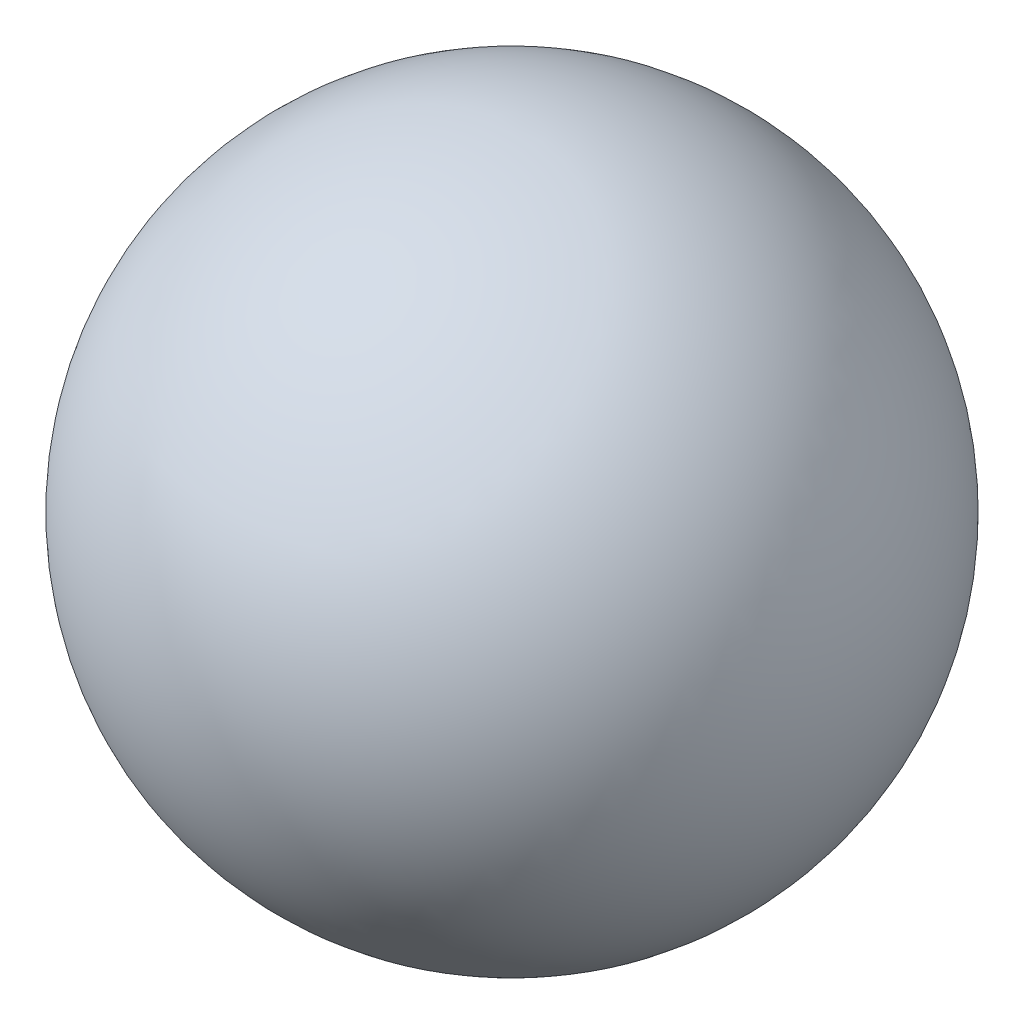
ISO-10303-21;
HEADER;
FILE_DESCRIPTION(('STEP AP214'),'2;1');
FILE_NAME('part.step','',(''),(''),'','','');
FILE_SCHEMA(('AUTOMOTIVE_DESIGN { 1 0 10303 214 1 1 1 1 }'));
ENDSEC;
DATA;
#1=APPLICATION_CONTEXT('core data for automotive mechanical design processes');
#2=APPLICATION_PROTOCOL_DEFINITION('international standard','automotive_design',2000,#1);
#3=PRODUCT_CONTEXT('',#1,'mechanical');
#4=PRODUCT('Part','Part','',(#3));
#5=PRODUCT_RELATED_PRODUCT_CATEGORY('part','',(#4));
#6=PRODUCT_DEFINITION_FORMATION('','',#4);
#7=PRODUCT_DEFINITION_CONTEXT('part definition',#1,'design');
#8=PRODUCT_DEFINITION('design','',#6,#7);
#9=PRODUCT_DEFINITION_SHAPE('','',#8);
#10=(LENGTH_UNIT() NAMED_UNIT(*) SI_UNIT(.MILLI.,.METRE.));
#11=(NAMED_UNIT(*) PLANE_ANGLE_UNIT() SI_UNIT($,.RADIAN.));
#12=(NAMED_UNIT(*) SI_UNIT($,.STERADIAN.) SOLID_ANGLE_UNIT());
#13=UNCERTAINTY_MEASURE_WITH_UNIT(LENGTH_MEASURE(1.E-05),#10,'distance_accuracy_value','');
#14=(GEOMETRIC_REPRESENTATION_CONTEXT(3) GLOBAL_UNCERTAINTY_ASSIGNED_CONTEXT((#13)) GLOBAL_UNIT_ASSIGNED_CONTEXT((#10,
#11,#12)) REPRESENTATION_CONTEXT('',''));
#15=CARTESIAN_POINT('',(0.,0.,0.));
#16=DIRECTION('',(0.,0.,1.));
#17=DIRECTION('',(1.,0.,0.));
#18=AXIS2_PLACEMENT_3D('',#15,#16,#17);
#19=CARTESIAN_POINT('',(0.,0.,0.));
#20=DIRECTION('',(0.,-1.,0.));
#21=DIRECTION('',(-1.,0.,0.));
#22=AXIS2_PLACEMENT_3D('',#19,#20,#21);
#23=SPHERICAL_SURFACE('',#22,7.);
#24=CARTESIAN_POINT('',(0.,-7.,0.));
#25=VERTEX_POINT('',#24);
#26=VERTEX_LOOP('',#25);
#27=FACE_BOUND('',#26,.T.);
#28=ADVANCED_FACE('F28',(#27),#23,.T.);
#29=CLOSED_SHELL('',(#28));
#30=MANIFOLD_SOLID_BREP('B2',#29);
#31=ADVANCED_BREP_SHAPE_REPRESENTATION('',(#18,#30),#14);
#32=SHAPE_DEFINITION_REPRESENTATION(#9,#31);
ENDSEC;
END-ISO-10303-21;
